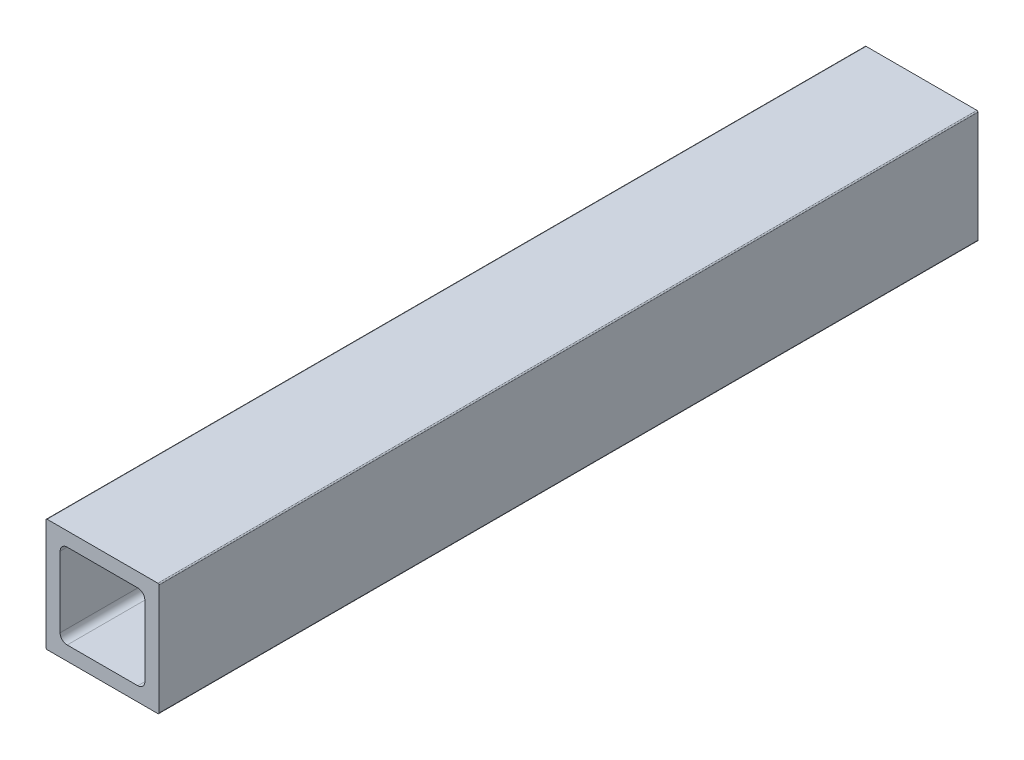
ISO-10303-21;
HEADER;
FILE_DESCRIPTION(('STEP AP214'),'2;1');
FILE_NAME('part.step','',(''),(''),'','','');
FILE_SCHEMA(('AUTOMOTIVE_DESIGN { 1 0 10303 214 1 1 1 1 }'));
ENDSEC;
DATA;
#1=APPLICATION_CONTEXT('core data for automotive mechanical design processes');
#2=APPLICATION_PROTOCOL_DEFINITION('international standard','automotive_design',2000,#1);
#3=PRODUCT_CONTEXT('',#1,'mechanical');
#4=PRODUCT('Part','Part','',(#3));
#5=PRODUCT_RELATED_PRODUCT_CATEGORY('part','',(#4));
#6=PRODUCT_DEFINITION_FORMATION('','',#4);
#7=PRODUCT_DEFINITION_CONTEXT('part definition',#1,'design');
#8=PRODUCT_DEFINITION('design','',#6,#7);
#9=PRODUCT_DEFINITION_SHAPE('','',#8);
#10=(LENGTH_UNIT() NAMED_UNIT(*) SI_UNIT(.MILLI.,.METRE.));
#11=(NAMED_UNIT(*) PLANE_ANGLE_UNIT() SI_UNIT($,.RADIAN.));
#12=(NAMED_UNIT(*) SI_UNIT($,.STERADIAN.) SOLID_ANGLE_UNIT());
#13=UNCERTAINTY_MEASURE_WITH_UNIT(LENGTH_MEASURE(1.E-05),#10,'distance_accuracy_value','');
#14=(GEOMETRIC_REPRESENTATION_CONTEXT(3) GLOBAL_UNCERTAINTY_ASSIGNED_CONTEXT((#13)) GLOBAL_UNIT_ASSIGNED_CONTEXT((#10,
#11,#12)) REPRESENTATION_CONTEXT('',''));
#15=CARTESIAN_POINT('',(0.,0.,0.));
#16=DIRECTION('',(0.,0.,1.));
#17=DIRECTION('',(1.,0.,0.));
#18=AXIS2_PLACEMENT_3D('',#15,#16,#17);
#19=CARTESIAN_POINT('',(0.254,0.254,0.));
#20=DIRECTION('',(0.,0.,-1.));
#21=DIRECTION('',(0.,-1.,0.));
#22=AXIS2_PLACEMENT_3D('',#19,#20,#21);
#23=PLANE('',#22);
#24=CARTESIAN_POINT('',(0.254,0.254,0.));
#25=DIRECTION('',(0.,0.,1.));
#26=DIRECTION('',(-1.,0.,0.));
#27=AXIS2_PLACEMENT_3D('',#24,#25,#26);
#28=CIRCLE('',#27,0.254);
#29=CARTESIAN_POINT('',(0.,0.254,0.));
#30=VERTEX_POINT('',#29);
#31=CARTESIAN_POINT('',(0.254,0.,0.));
#32=VERTEX_POINT('',#31);
#33=EDGE_CURVE('E193',#30,#32,#28,.T.);
#34=ORIENTED_EDGE('',*,*,#33,.F.);
#35=DIRECTION('',(0.,-1.,0.));
#36=VECTOR('',#35,1.);
#37=CARTESIAN_POINT('',(0.,0.254,0.));
#38=LINE('',#37,#36);
#39=CARTESIAN_POINT('',(0.,25.146,0.));
#40=VERTEX_POINT('',#39);
#41=EDGE_CURVE('E191',#40,#30,#38,.T.);
#42=ORIENTED_EDGE('',*,*,#41,.F.);
#43=CARTESIAN_POINT('',(0.254,25.146,0.));
#44=DIRECTION('',(0.,0.,1.));
#45=DIRECTION('',(-1.,0.,0.));
#46=AXIS2_PLACEMENT_3D('',#43,#44,#45);
#47=CIRCLE('',#46,0.254);
#48=CARTESIAN_POINT('',(0.254,25.4,0.));
#49=VERTEX_POINT('',#48);
#50=EDGE_CURVE('E213',#49,#40,#47,.T.);
#51=ORIENTED_EDGE('',*,*,#50,.F.);
#52=DIRECTION('',(-1.,0.,0.));
#53=VECTOR('',#52,1.);
#54=CARTESIAN_POINT('',(0.254,25.4,0.));
#55=LINE('',#54,#53);
#56=CARTESIAN_POINT('',(25.146,25.4,0.));
#57=VERTEX_POINT('',#56);
#58=EDGE_CURVE('E204',#57,#49,#55,.T.);
#59=ORIENTED_EDGE('',*,*,#58,.F.);
#60=CARTESIAN_POINT('',(25.146,25.146,0.));
#61=DIRECTION('',(0.,0.,1.));
#62=DIRECTION('',(-1.,0.,0.));
#63=AXIS2_PLACEMENT_3D('',#60,#61,#62);
#64=CIRCLE('',#63,0.254);
#65=CARTESIAN_POINT('',(25.4,25.146,0.));
#66=VERTEX_POINT('',#65);
#67=EDGE_CURVE('E236',#66,#57,#64,.T.);
#68=ORIENTED_EDGE('',*,*,#67,.F.);
#69=DIRECTION('',(0.,1.,0.));
#70=VECTOR('',#69,1.);
#71=CARTESIAN_POINT('',(25.4,0.254,0.));
#72=LINE('',#71,#70);
#73=CARTESIAN_POINT('',(25.4,0.254,0.));
#74=VERTEX_POINT('',#73);
#75=EDGE_CURVE('E235',#74,#66,#72,.T.);
#76=ORIENTED_EDGE('',*,*,#75,.F.);
#77=CARTESIAN_POINT('',(25.146,0.254,0.));
#78=DIRECTION('',(0.,0.,1.));
#79=DIRECTION('',(1.,0.,0.));
#80=AXIS2_PLACEMENT_3D('',#77,#78,#79);
#81=CIRCLE('',#80,0.254);
#82=CARTESIAN_POINT('',(25.146,0.,0.));
#83=VERTEX_POINT('',#82);
#84=EDGE_CURVE('E206',#83,#74,#81,.T.);
#85=ORIENTED_EDGE('',*,*,#84,.F.);
#86=DIRECTION('',(1.,0.,0.));
#87=VECTOR('',#86,1.);
#88=CARTESIAN_POINT('',(0.254,0.,0.));
#89=LINE('',#88,#87);
#90=EDGE_CURVE('E194',#32,#83,#89,.T.);
#91=ORIENTED_EDGE('',*,*,#90,.F.);
#92=EDGE_LOOP('',(#34,#42,#51,#59,#68,#76,#85,#91));
#93=FACE_BOUND('',#92,.T.);
#94=DIRECTION('',(0.,-1.,0.));
#95=VECTOR('',#94,1.);
#96=CARTESIAN_POINT('',(3.175,4.7625,0.));
#97=LINE('',#96,#95);
#98=CARTESIAN_POINT('',(3.175,20.6375,0.));
#99=VERTEX_POINT('',#98);
#100=CARTESIAN_POINT('',(3.175,4.7625,0.));
#101=VERTEX_POINT('',#100);
#102=EDGE_CURVE('E52',#99,#101,#97,.T.);
#103=ORIENTED_EDGE('',*,*,#102,.T.);
#104=CARTESIAN_POINT('',(4.7625,4.7625,0.));
#105=DIRECTION('',(0.,0.,1.));
#106=DIRECTION('',(1.,0.,0.));
#107=AXIS2_PLACEMENT_3D('',#104,#105,#106);
#108=CIRCLE('',#107,1.5875);
#109=CARTESIAN_POINT('',(4.7625,3.175,0.));
#110=VERTEX_POINT('',#109);
#111=EDGE_CURVE('E266',#101,#110,#108,.T.);
#112=ORIENTED_EDGE('',*,*,#111,.T.);
#113=DIRECTION('',(1.,0.,0.));
#114=VECTOR('',#113,1.);
#115=CARTESIAN_POINT('',(4.7625,3.175,0.));
#116=LINE('',#115,#114);
#117=CARTESIAN_POINT('',(20.6375,3.175,0.));
#118=VERTEX_POINT('',#117);
#119=EDGE_CURVE('E250',#110,#118,#116,.T.);
#120=ORIENTED_EDGE('',*,*,#119,.T.);
#121=CARTESIAN_POINT('',(20.6375,4.7625,0.));
#122=DIRECTION('',(0.,0.,1.));
#123=DIRECTION('',(-1.,0.,0.));
#124=AXIS2_PLACEMENT_3D('',#121,#122,#123);
#125=CIRCLE('',#124,1.5875);
#126=CARTESIAN_POINT('',(22.225,4.7625,0.));
#127=VERTEX_POINT('',#126);
#128=EDGE_CURVE('E223',#118,#127,#125,.T.);
#129=ORIENTED_EDGE('',*,*,#128,.T.);
#130=DIRECTION('',(0.,1.,0.));
#131=VECTOR('',#130,1.);
#132=CARTESIAN_POINT('',(22.225,4.7625,0.));
#133=LINE('',#132,#131);
#134=CARTESIAN_POINT('',(22.225,20.6375,0.));
#135=VERTEX_POINT('',#134);
#136=EDGE_CURVE('E219',#127,#135,#133,.T.);
#137=ORIENTED_EDGE('',*,*,#136,.T.);
#138=CARTESIAN_POINT('',(20.6375,20.6375,0.));
#139=DIRECTION('',(0.,0.,1.));
#140=DIRECTION('',(-1.,0.,0.));
#141=AXIS2_PLACEMENT_3D('',#138,#139,#140);
#142=CIRCLE('',#141,1.5875);
#143=CARTESIAN_POINT('',(20.6375,22.225,0.));
#144=VERTEX_POINT('',#143);
#145=EDGE_CURVE('E224',#135,#144,#142,.T.);
#146=ORIENTED_EDGE('',*,*,#145,.T.);
#147=DIRECTION('',(-1.,0.,0.));
#148=VECTOR('',#147,1.);
#149=CARTESIAN_POINT('',(4.7625,22.225,0.));
#150=LINE('',#149,#148);
#151=CARTESIAN_POINT('',(4.7625,22.225,0.));
#152=VERTEX_POINT('',#151);
#153=EDGE_CURVE('E229',#144,#152,#150,.T.);
#154=ORIENTED_EDGE('',*,*,#153,.T.);
#155=CARTESIAN_POINT('',(4.7625,20.6375,0.));
#156=DIRECTION('',(0.,0.,1.));
#157=DIRECTION('',(-1.,0.,0.));
#158=AXIS2_PLACEMENT_3D('',#155,#156,#157);
#159=CIRCLE('',#158,1.5875);
#160=EDGE_CURVE('E197',#152,#99,#159,.T.);
#161=ORIENTED_EDGE('',*,*,#160,.T.);
#162=EDGE_LOOP('',(#103,#112,#120,#129,#137,#146,#154,#161));
#163=FACE_BOUND('',#162,.T.);
#164=ADVANCED_FACE('F44',(#93,#163),#23,.T.);
#165=CARTESIAN_POINT('',(0.254,0.254,1828.8));
#166=DIRECTION('',(0.,0.,-1.));
#167=DIRECTION('',(-1.,0.,0.));
#168=AXIS2_PLACEMENT_3D('',#165,#166,#167);
#169=CYLINDRICAL_SURFACE('',#168,0.254);
#170=CARTESIAN_POINT('',(0.254,0.254,184.15));
#171=DIRECTION('',(0.,0.,-1.));
#172=DIRECTION('',(-1.,0.,0.));
#173=AXIS2_PLACEMENT_3D('',#170,#171,#172);
#174=CIRCLE('',#173,0.254);
#175=CARTESIAN_POINT('',(0.,0.254,184.15));
#176=VERTEX_POINT('',#175);
#177=CARTESIAN_POINT('',(0.254,0.,184.15));
#178=VERTEX_POINT('',#177);
#179=EDGE_CURVE('E172',#176,#178,#174,.F.);
#180=ORIENTED_EDGE('',*,*,#179,.F.);
#181=DIRECTION('',(0.,0.,-1.));
#182=VECTOR('',#181,1.);
#183=CARTESIAN_POINT('',(0.,0.254,1828.8));
#184=LINE('',#183,#182);
#185=EDGE_CURVE('E183',#176,#30,#184,.T.);
#186=ORIENTED_EDGE('',*,*,#185,.T.);
#187=ORIENTED_EDGE('',*,*,#33,.T.);
#188=DIRECTION('',(0.,0.,-1.));
#189=VECTOR('',#188,1.);
#190=CARTESIAN_POINT('',(0.254,0.,1828.8));
#191=LINE('',#190,#189);
#192=EDGE_CURVE('E185',#178,#32,#191,.T.);
#193=ORIENTED_EDGE('',*,*,#192,.F.);
#194=EDGE_LOOP('',(#180,#186,#187,#193));
#195=FACE_BOUND('',#194,.T.);
#196=ADVANCED_FACE('F181',(#195),#169,.T.);
#197=CARTESIAN_POINT('',(0.254,0.,1828.8));
#198=DIRECTION('',(0.,1.,0.));
#199=DIRECTION('',(1.,0.,0.));
#200=AXIS2_PLACEMENT_3D('',#197,#198,#199);
#201=PLANE('',#200);
#202=DIRECTION('',(0.,0.,-1.));
#203=VECTOR('',#202,1.);
#204=CARTESIAN_POINT('',(25.146,0.,1828.8));
#205=LINE('',#204,#203);
#206=CARTESIAN_POINT('',(25.146,0.,184.15));
#207=VERTEX_POINT('',#206);
#208=EDGE_CURVE('E210',#207,#83,#205,.T.);
#209=ORIENTED_EDGE('',*,*,#208,.F.);
#210=DIRECTION('',(1.,0.,0.));
#211=VECTOR('',#210,1.);
#212=CARTESIAN_POINT('',(0.,0.,184.15));
#213=LINE('',#212,#211);
#214=EDGE_CURVE('E177',#178,#207,#213,.T.);
#215=ORIENTED_EDGE('',*,*,#214,.F.);
#216=ORIENTED_EDGE('',*,*,#192,.T.);
#217=ORIENTED_EDGE('',*,*,#90,.T.);
#218=EDGE_LOOP('',(#209,#215,#216,#217));
#219=FACE_BOUND('',#218,.T.);
#220=ADVANCED_FACE('F289',(#219),#201,.F.);
#221=CARTESIAN_POINT('',(25.146,0.254,1828.8));
#222=DIRECTION('',(0.,0.,-1.));
#223=DIRECTION('',(-1.,0.,0.));
#224=AXIS2_PLACEMENT_3D('',#221,#222,#223);
#225=CYLINDRICAL_SURFACE('',#224,0.254);
#226=CARTESIAN_POINT('',(25.146,0.254,184.15));
#227=DIRECTION('',(0.,0.,-1.));
#228=DIRECTION('',(-1.,0.,0.));
#229=AXIS2_PLACEMENT_3D('',#226,#227,#228);
#230=CIRCLE('',#229,0.254);
#231=CARTESIAN_POINT('',(25.4,0.254,184.15));
#232=VERTEX_POINT('',#231);
#233=EDGE_CURVE('E187',#207,#232,#230,.F.);
#234=ORIENTED_EDGE('',*,*,#233,.F.);
#235=ORIENTED_EDGE('',*,*,#208,.T.);
#236=ORIENTED_EDGE('',*,*,#84,.T.);
#237=DIRECTION('',(0.,0.,-1.));
#238=VECTOR('',#237,1.);
#239=CARTESIAN_POINT('',(25.4,0.254,1828.8));
#240=LINE('',#239,#238);
#241=EDGE_CURVE('E233',#232,#74,#240,.T.);
#242=ORIENTED_EDGE('',*,*,#241,.F.);
#243=EDGE_LOOP('',(#234,#235,#236,#242));
#244=FACE_BOUND('',#243,.T.);
#245=ADVANCED_FACE('F283',(#244),#225,.T.);
#246=CARTESIAN_POINT('',(25.4,0.254,1828.8));
#247=DIRECTION('',(-1.,0.,0.));
#248=DIRECTION('',(0.,0.,1.));
#249=AXIS2_PLACEMENT_3D('',#246,#247,#248);
#250=PLANE('',#249);
#251=DIRECTION('',(0.,0.,-1.));
#252=VECTOR('',#251,1.);
#253=CARTESIAN_POINT('',(25.4,25.146,1828.8));
#254=LINE('',#253,#252);
#255=CARTESIAN_POINT('',(25.4,25.146,184.15));
#256=VERTEX_POINT('',#255);
#257=EDGE_CURVE('E258',#256,#66,#254,.T.);
#258=ORIENTED_EDGE('',*,*,#257,.F.);
#259=DIRECTION('',(0.,1.,0.));
#260=VECTOR('',#259,1.);
#261=CARTESIAN_POINT('',(25.4,0.,184.15));
#262=LINE('',#261,#260);
#263=EDGE_CURVE('E498',#232,#256,#262,.T.);
#264=ORIENTED_EDGE('',*,*,#263,.F.);
#265=ORIENTED_EDGE('',*,*,#241,.T.);
#266=ORIENTED_EDGE('',*,*,#75,.T.);
#267=EDGE_LOOP('',(#258,#264,#265,#266));
#268=FACE_BOUND('',#267,.T.);
#269=ADVANCED_FACE('F288',(#268),#250,.F.);
#270=CARTESIAN_POINT('',(25.146,25.146,1828.8));
#271=DIRECTION('',(0.,0.,-1.));
#272=DIRECTION('',(-1.,0.,0.));
#273=AXIS2_PLACEMENT_3D('',#270,#271,#272);
#274=CYLINDRICAL_SURFACE('',#273,0.254);
#275=CARTESIAN_POINT('',(25.146,25.146,184.15));
#276=DIRECTION('',(0.,0.,-1.));
#277=DIRECTION('',(-1.,0.,0.));
#278=AXIS2_PLACEMENT_3D('',#275,#276,#277);
#279=CIRCLE('',#278,0.254);
#280=CARTESIAN_POINT('',(25.146,25.4,184.15));
#281=VERTEX_POINT('',#280);
#282=EDGE_CURVE('E492',#256,#281,#279,.F.);
#283=ORIENTED_EDGE('',*,*,#282,.F.);
#284=ORIENTED_EDGE('',*,*,#257,.T.);
#285=ORIENTED_EDGE('',*,*,#67,.T.);
#286=DIRECTION('',(0.,0.,-1.));
#287=VECTOR('',#286,1.);
#288=CARTESIAN_POINT('',(25.146,25.4,1828.8));
#289=LINE('',#288,#287);
#290=EDGE_CURVE('E227',#281,#57,#289,.T.);
#291=ORIENTED_EDGE('',*,*,#290,.F.);
#292=EDGE_LOOP('',(#283,#284,#285,#291));
#293=FACE_BOUND('',#292,.T.);
#294=ADVANCED_FACE('F46',(#293),#274,.T.);
#295=CARTESIAN_POINT('',(0.254,25.4,1828.8));
#296=DIRECTION('',(0.,-1.,0.));
#297=DIRECTION('',(0.,0.,-1.));
#298=AXIS2_PLACEMENT_3D('',#295,#296,#297);
#299=PLANE('',#298);
#300=DIRECTION('',(0.,0.,-1.));
#301=VECTOR('',#300,1.);
#302=CARTESIAN_POINT('',(0.254,25.4,1828.8));
#303=LINE('',#302,#301);
#304=CARTESIAN_POINT('',(0.254,25.4,184.15));
#305=VERTEX_POINT('',#304);
#306=EDGE_CURVE('E211',#305,#49,#303,.T.);
#307=ORIENTED_EDGE('',*,*,#306,.F.);
#308=DIRECTION('',(-1.,0.,0.));
#309=VECTOR('',#308,1.);
#310=CARTESIAN_POINT('',(0.,25.4,184.15));
#311=LINE('',#310,#309);
#312=EDGE_CURVE('E545',#281,#305,#311,.T.);
#313=ORIENTED_EDGE('',*,*,#312,.F.);
#314=ORIENTED_EDGE('',*,*,#290,.T.);
#315=ORIENTED_EDGE('',*,*,#58,.T.);
#316=EDGE_LOOP('',(#307,#313,#314,#315));
#317=FACE_BOUND('',#316,.T.);
#318=ADVANCED_FACE('F347',(#317),#299,.F.);
#319=CARTESIAN_POINT('',(0.254,25.146,1828.8));
#320=DIRECTION('',(0.,0.,-1.));
#321=DIRECTION('',(-1.,0.,0.));
#322=AXIS2_PLACEMENT_3D('',#319,#320,#321);
#323=CYLINDRICAL_SURFACE('',#322,0.254);
#324=CARTESIAN_POINT('',(0.254,25.146,184.15));
#325=DIRECTION('',(0.,0.,-1.));
#326=DIRECTION('',(-1.,0.,0.));
#327=AXIS2_PLACEMENT_3D('',#324,#325,#326);
#328=CIRCLE('',#327,0.254);
#329=CARTESIAN_POINT('',(0.,25.146,184.15));
#330=VERTEX_POINT('',#329);
#331=EDGE_CURVE('E59',#305,#330,#328,.F.);
#332=ORIENTED_EDGE('',*,*,#331,.F.);
#333=ORIENTED_EDGE('',*,*,#306,.T.);
#334=ORIENTED_EDGE('',*,*,#50,.T.);
#335=DIRECTION('',(0.,0.,-1.));
#336=VECTOR('',#335,1.);
#337=CARTESIAN_POINT('',(0.,25.146,1828.8));
#338=LINE('',#337,#336);
#339=EDGE_CURVE('E216',#330,#40,#338,.T.);
#340=ORIENTED_EDGE('',*,*,#339,.F.);
#341=EDGE_LOOP('',(#332,#333,#334,#340));
#342=FACE_BOUND('',#341,.T.);
#343=ADVANCED_FACE('F276',(#342),#323,.T.);
#344=CARTESIAN_POINT('',(0.,0.254,1828.8));
#345=DIRECTION('',(1.,0.,0.));
#346=DIRECTION('',(0.,1.,0.));
#347=AXIS2_PLACEMENT_3D('',#344,#345,#346);
#348=PLANE('',#347);
#349=ORIENTED_EDGE('',*,*,#185,.F.);
#350=DIRECTION('',(0.,-1.,0.));
#351=VECTOR('',#350,1.);
#352=CARTESIAN_POINT('',(0.,0.,184.15));
#353=LINE('',#352,#351);
#354=EDGE_CURVE('E169',#330,#176,#353,.T.);
#355=ORIENTED_EDGE('',*,*,#354,.F.);
#356=ORIENTED_EDGE('',*,*,#339,.T.);
#357=ORIENTED_EDGE('',*,*,#41,.T.);
#358=EDGE_LOOP('',(#349,#355,#356,#357));
#359=FACE_BOUND('',#358,.T.);
#360=ADVANCED_FACE('F189',(#359),#348,.F.);
#361=CARTESIAN_POINT('',(4.7625,4.7625,1828.8));
#362=DIRECTION('',(0.,0.,-1.));
#363=DIRECTION('',(-1.,0.,0.));
#364=AXIS2_PLACEMENT_3D('',#361,#362,#363);
#365=CYLINDRICAL_SURFACE('',#364,1.5875);
#366=DIRECTION('',(0.,0.,-1.));
#367=VECTOR('',#366,1.);
#368=CARTESIAN_POINT('',(3.175,4.7625,1828.8));
#369=LINE('',#368,#367);
#370=CARTESIAN_POINT('',(3.175,4.7625,184.15));
#371=VERTEX_POINT('',#370);
#372=EDGE_CURVE('E186',#371,#101,#369,.T.);
#373=ORIENTED_EDGE('',*,*,#372,.F.);
#374=CARTESIAN_POINT('',(4.7625,4.7625,184.15));
#375=DIRECTION('',(0.,0.,-1.));
#376=DIRECTION('',(-1.,0.,0.));
#377=AXIS2_PLACEMENT_3D('',#374,#375,#376);
#378=CIRCLE('',#377,1.5875);
#379=CARTESIAN_POINT('',(4.7625,3.175,184.15));
#380=VERTEX_POINT('',#379);
#381=EDGE_CURVE('E66',#371,#380,#378,.F.);
#382=ORIENTED_EDGE('',*,*,#381,.T.);
#383=DIRECTION('',(0.,0.,-1.));
#384=VECTOR('',#383,1.);
#385=CARTESIAN_POINT('',(4.7625,3.175,1828.8));
#386=LINE('',#385,#384);
#387=EDGE_CURVE('E214',#380,#110,#386,.T.);
#388=ORIENTED_EDGE('',*,*,#387,.T.);
#389=ORIENTED_EDGE('',*,*,#111,.F.);
#390=EDGE_LOOP('',(#373,#382,#388,#389));
#391=FACE_BOUND('',#390,.T.);
#392=ADVANCED_FACE('F275',(#391),#365,.F.);
#393=CARTESIAN_POINT('',(4.7625,3.175,1828.8));
#394=DIRECTION('',(0.,1.,0.));
#395=DIRECTION('',(1.,0.,0.));
#396=AXIS2_PLACEMENT_3D('',#393,#394,#395);
#397=PLANE('',#396);
#398=DIRECTION('',(-1.,0.,0.));
#399=VECTOR('',#398,1.);
#400=CARTESIAN_POINT('',(4.7625,3.175,184.15));
#401=LINE('',#400,#399);
#402=CARTESIAN_POINT('',(20.6375,3.175,184.15));
#403=VERTEX_POINT('',#402);
#404=EDGE_CURVE('E532',#403,#380,#401,.T.);
#405=ORIENTED_EDGE('',*,*,#404,.F.);
#406=DIRECTION('',(0.,0.,-1.));
#407=VECTOR('',#406,1.);
#408=CARTESIAN_POINT('',(20.6375,3.175,1828.8));
#409=LINE('',#408,#407);
#410=EDGE_CURVE('E217',#403,#118,#409,.T.);
#411=ORIENTED_EDGE('',*,*,#410,.T.);
#412=ORIENTED_EDGE('',*,*,#119,.F.);
#413=ORIENTED_EDGE('',*,*,#387,.F.);
#414=EDGE_LOOP('',(#405,#411,#412,#413));
#415=FACE_BOUND('',#414,.T.);
#416=ADVANCED_FACE('F302',(#415),#397,.T.);
#417=CARTESIAN_POINT('',(20.6375,4.7625,1828.8));
#418=DIRECTION('',(0.,0.,-1.));
#419=DIRECTION('',(-1.,0.,0.));
#420=AXIS2_PLACEMENT_3D('',#417,#418,#419);
#421=CYLINDRICAL_SURFACE('',#420,1.5875);
#422=ORIENTED_EDGE('',*,*,#410,.F.);
#423=CARTESIAN_POINT('',(20.6375,4.7625,184.15));
#424=DIRECTION('',(0.,0.,-1.));
#425=DIRECTION('',(-1.,0.,0.));
#426=AXIS2_PLACEMENT_3D('',#423,#424,#425);
#427=CIRCLE('',#426,1.5875);
#428=CARTESIAN_POINT('',(22.225,4.7625,184.15));
#429=VERTEX_POINT('',#428);
#430=EDGE_CURVE('E513',#403,#429,#427,.F.);
#431=ORIENTED_EDGE('',*,*,#430,.T.);
#432=DIRECTION('',(0.,0.,-1.));
#433=VECTOR('',#432,1.);
#434=CARTESIAN_POINT('',(22.225,4.7625,1828.8));
#435=LINE('',#434,#433);
#436=EDGE_CURVE('E254',#429,#127,#435,.T.);
#437=ORIENTED_EDGE('',*,*,#436,.T.);
#438=ORIENTED_EDGE('',*,*,#128,.F.);
#439=EDGE_LOOP('',(#422,#431,#437,#438));
#440=FACE_BOUND('',#439,.T.);
#441=ADVANCED_FACE('F297',(#440),#421,.F.);
#442=CARTESIAN_POINT('',(22.225,4.7625,1828.8));
#443=DIRECTION('',(-1.,0.,0.));
#444=DIRECTION('',(0.,0.,1.));
#445=AXIS2_PLACEMENT_3D('',#442,#443,#444);
#446=PLANE('',#445);
#447=DIRECTION('',(0.,-1.,0.));
#448=VECTOR('',#447,1.);
#449=CARTESIAN_POINT('',(22.225,4.7625,184.15));
#450=LINE('',#449,#448);
#451=CARTESIAN_POINT('',(22.225,20.6375,184.15));
#452=VERTEX_POINT('',#451);
#453=EDGE_CURVE('E535',#452,#429,#450,.T.);
#454=ORIENTED_EDGE('',*,*,#453,.F.);
#455=DIRECTION('',(0.,0.,-1.));
#456=VECTOR('',#455,1.);
#457=CARTESIAN_POINT('',(22.225,20.6375,1828.8));
#458=LINE('',#457,#456);
#459=EDGE_CURVE('E240',#452,#135,#458,.T.);
#460=ORIENTED_EDGE('',*,*,#459,.T.);
#461=ORIENTED_EDGE('',*,*,#136,.F.);
#462=ORIENTED_EDGE('',*,*,#436,.F.);
#463=EDGE_LOOP('',(#454,#460,#461,#462));
#464=FACE_BOUND('',#463,.T.);
#465=ADVANCED_FACE('F301',(#464),#446,.T.);
#466=CARTESIAN_POINT('',(20.6375,20.6375,1828.8));
#467=DIRECTION('',(0.,0.,-1.));
#468=DIRECTION('',(-1.,0.,0.));
#469=AXIS2_PLACEMENT_3D('',#466,#467,#468);
#470=CYLINDRICAL_SURFACE('',#469,1.5875);
#471=ORIENTED_EDGE('',*,*,#459,.F.);
#472=CARTESIAN_POINT('',(20.6375,20.6375,184.15));
#473=DIRECTION('',(0.,0.,-1.));
#474=DIRECTION('',(-1.,0.,0.));
#475=AXIS2_PLACEMENT_3D('',#472,#473,#474);
#476=CIRCLE('',#475,1.5875);
#477=CARTESIAN_POINT('',(20.6375,22.225,184.15));
#478=VERTEX_POINT('',#477);
#479=EDGE_CURVE('E537',#452,#478,#476,.F.);
#480=ORIENTED_EDGE('',*,*,#479,.T.);
#481=DIRECTION('',(0.,0.,-1.));
#482=VECTOR('',#481,1.);
#483=CARTESIAN_POINT('',(20.6375,22.225,1828.8));
#484=LINE('',#483,#482);
#485=EDGE_CURVE('E238',#478,#144,#484,.T.);
#486=ORIENTED_EDGE('',*,*,#485,.T.);
#487=ORIENTED_EDGE('',*,*,#145,.F.);
#488=EDGE_LOOP('',(#471,#480,#486,#487));
#489=FACE_BOUND('',#488,.T.);
#490=ADVANCED_FACE('F309',(#489),#470,.F.);
#491=CARTESIAN_POINT('',(4.7625,22.225,1828.8));
#492=DIRECTION('',(0.,-1.,0.));
#493=DIRECTION('',(0.,0.,-1.));
#494=AXIS2_PLACEMENT_3D('',#491,#492,#493);
#495=PLANE('',#494);
#496=DIRECTION('',(1.,0.,0.));
#497=VECTOR('',#496,1.);
#498=CARTESIAN_POINT('',(4.7625,22.225,184.15));
#499=LINE('',#498,#497);
#500=CARTESIAN_POINT('',(4.7625,22.225,184.15));
#501=VERTEX_POINT('',#500);
#502=EDGE_CURVE('E540',#501,#478,#499,.T.);
#503=ORIENTED_EDGE('',*,*,#502,.F.);
#504=DIRECTION('',(0.,0.,-1.));
#505=VECTOR('',#504,1.);
#506=CARTESIAN_POINT('',(4.7625,22.225,1828.8));
#507=LINE('',#506,#505);
#508=EDGE_CURVE('E241',#501,#152,#507,.T.);
#509=ORIENTED_EDGE('',*,*,#508,.T.);
#510=ORIENTED_EDGE('',*,*,#153,.F.);
#511=ORIENTED_EDGE('',*,*,#485,.F.);
#512=EDGE_LOOP('',(#503,#509,#510,#511));
#513=FACE_BOUND('',#512,.T.);
#514=ADVANCED_FACE('F313',(#513),#495,.T.);
#515=CARTESIAN_POINT('',(4.7625,20.6375,1828.8));
#516=DIRECTION('',(0.,0.,-1.));
#517=DIRECTION('',(-1.,0.,0.));
#518=AXIS2_PLACEMENT_3D('',#515,#516,#517);
#519=CYLINDRICAL_SURFACE('',#518,1.5875);
#520=ORIENTED_EDGE('',*,*,#508,.F.);
#521=CARTESIAN_POINT('',(4.7625,20.6375,184.15));
#522=DIRECTION('',(0.,0.,-1.));
#523=DIRECTION('',(-1.,0.,0.));
#524=AXIS2_PLACEMENT_3D('',#521,#522,#523);
#525=CIRCLE('',#524,1.5875);
#526=CARTESIAN_POINT('',(3.175,20.6375,184.15));
#527=VERTEX_POINT('',#526);
#528=EDGE_CURVE('E542',#501,#527,#525,.F.);
#529=ORIENTED_EDGE('',*,*,#528,.T.);
#530=DIRECTION('',(0.,0.,-1.));
#531=VECTOR('',#530,1.);
#532=CARTESIAN_POINT('',(3.175,20.6375,1828.8));
#533=LINE('',#532,#531);
#534=EDGE_CURVE('E245',#527,#99,#533,.T.);
#535=ORIENTED_EDGE('',*,*,#534,.T.);
#536=ORIENTED_EDGE('',*,*,#160,.F.);
#537=EDGE_LOOP('',(#520,#529,#535,#536));
#538=FACE_BOUND('',#537,.T.);
#539=ADVANCED_FACE('F390',(#538),#519,.F.);
#540=CARTESIAN_POINT('',(3.175,4.7625,1828.8));
#541=DIRECTION('',(1.,0.,0.));
#542=DIRECTION('',(0.,1.,0.));
#543=AXIS2_PLACEMENT_3D('',#540,#541,#542);
#544=PLANE('',#543);
#545=DIRECTION('',(0.,1.,0.));
#546=VECTOR('',#545,1.);
#547=CARTESIAN_POINT('',(3.175,4.7625,184.15));
#548=LINE('',#547,#546);
#549=EDGE_CURVE('E11',#371,#527,#548,.T.);
#550=ORIENTED_EDGE('',*,*,#549,.F.);
#551=ORIENTED_EDGE('',*,*,#372,.T.);
#552=ORIENTED_EDGE('',*,*,#102,.F.);
#553=ORIENTED_EDGE('',*,*,#534,.F.);
#554=EDGE_LOOP('',(#550,#551,#552,#553));
#555=FACE_BOUND('',#554,.T.);
#556=ADVANCED_FACE('F394',(#555),#544,.T.);
#557=CARTESIAN_POINT('',(0.,0.,184.15));
#558=DIRECTION('',(0.,0.,-1.));
#559=DIRECTION('',(-1.,0.,0.));
#560=AXIS2_PLACEMENT_3D('',#557,#558,#559);
#561=PLANE('',#560);
#562=ORIENTED_EDGE('',*,*,#179,.T.);
#563=ORIENTED_EDGE('',*,*,#214,.T.);
#564=ORIENTED_EDGE('',*,*,#233,.T.);
#565=ORIENTED_EDGE('',*,*,#263,.T.);
#566=ORIENTED_EDGE('',*,*,#282,.T.);
#567=ORIENTED_EDGE('',*,*,#312,.T.);
#568=ORIENTED_EDGE('',*,*,#331,.T.);
#569=ORIENTED_EDGE('',*,*,#354,.T.);
#570=EDGE_LOOP('',(#562,#563,#564,#565,#566,#567,#568,#569));
#571=FACE_BOUND('',#570,.T.);
#572=ORIENTED_EDGE('',*,*,#549,.T.);
#573=ORIENTED_EDGE('',*,*,#528,.F.);
#574=ORIENTED_EDGE('',*,*,#502,.T.);
#575=ORIENTED_EDGE('',*,*,#479,.F.);
#576=ORIENTED_EDGE('',*,*,#453,.T.);
#577=ORIENTED_EDGE('',*,*,#430,.F.);
#578=ORIENTED_EDGE('',*,*,#404,.T.);
#579=ORIENTED_EDGE('',*,*,#381,.F.);
#580=EDGE_LOOP('',(#572,#573,#574,#575,#576,#577,#578,#579));
#581=FACE_BOUND('',#580,.T.);
#582=ADVANCED_FACE('F171',(#571,#581),#561,.F.);
#583=CLOSED_SHELL('',(#164,#196,#220,#245,#269,#294,#318,#343,#360,#392,#416,#441,#465,#490,
#514,#539,#556,#582));
#584=MANIFOLD_SOLID_BREP('B2',#583);
#585=ADVANCED_BREP_SHAPE_REPRESENTATION('',(#18,#584),#14);
#586=SHAPE_DEFINITION_REPRESENTATION(#9,#585);
ENDSEC;
END-ISO-10303-21;
